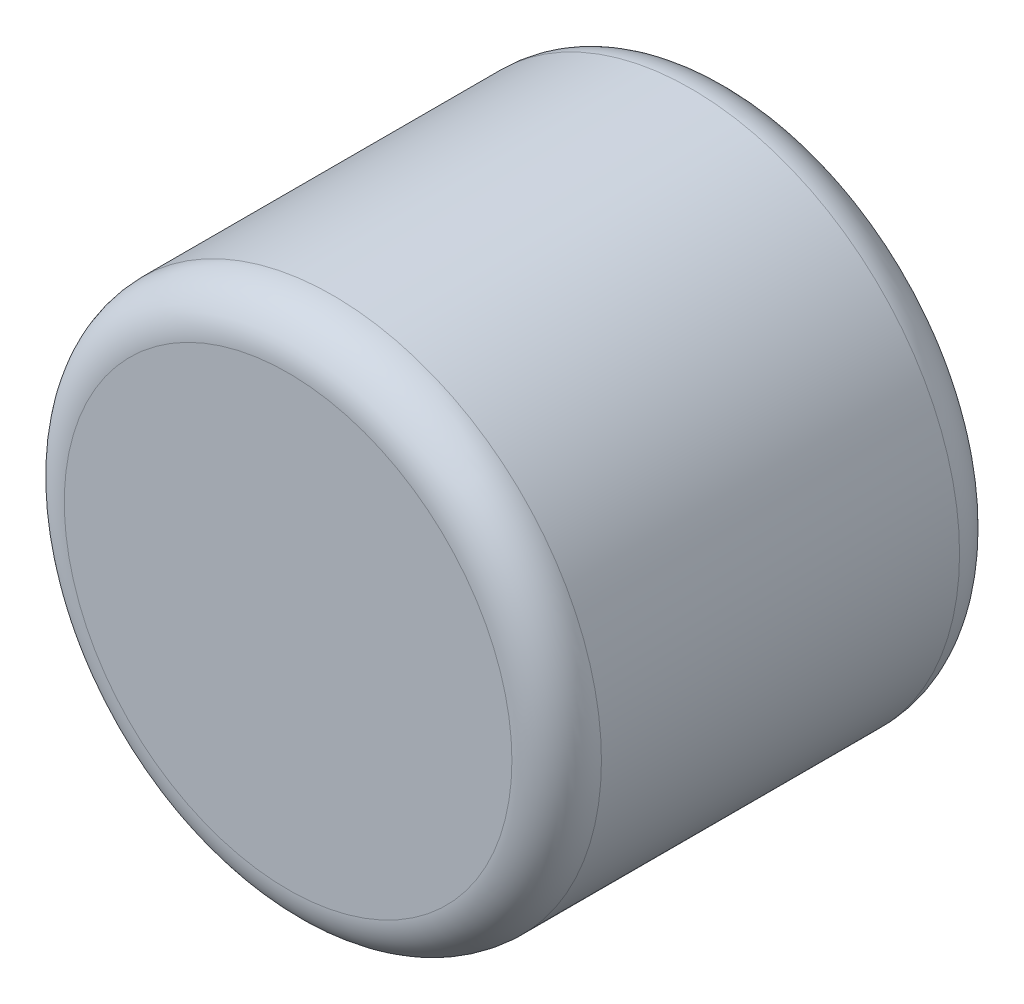
ISO-10303-21;
HEADER;
FILE_DESCRIPTION(('STEP AP214'),'2;1');
FILE_NAME('part.step','',(''),(''),'','','');
FILE_SCHEMA(('AUTOMOTIVE_DESIGN { 1 0 10303 214 1 1 1 1 }'));
ENDSEC;
DATA;
#1=APPLICATION_CONTEXT('core data for automotive mechanical design processes');
#2=APPLICATION_PROTOCOL_DEFINITION('international standard','automotive_design',2000,#1);
#3=PRODUCT_CONTEXT('',#1,'mechanical');
#4=PRODUCT('Part','Part','',(#3));
#5=PRODUCT_RELATED_PRODUCT_CATEGORY('part','',(#4));
#6=PRODUCT_DEFINITION_FORMATION('','',#4);
#7=PRODUCT_DEFINITION_CONTEXT('part definition',#1,'design');
#8=PRODUCT_DEFINITION('design','',#6,#7);
#9=PRODUCT_DEFINITION_SHAPE('','',#8);
#10=(LENGTH_UNIT() NAMED_UNIT(*) SI_UNIT(.MILLI.,.METRE.));
#11=(NAMED_UNIT(*) PLANE_ANGLE_UNIT() SI_UNIT($,.RADIAN.));
#12=(NAMED_UNIT(*) SI_UNIT($,.STERADIAN.) SOLID_ANGLE_UNIT());
#13=UNCERTAINTY_MEASURE_WITH_UNIT(LENGTH_MEASURE(1.E-05),#10,'distance_accuracy_value','');
#14=(GEOMETRIC_REPRESENTATION_CONTEXT(3) GLOBAL_UNCERTAINTY_ASSIGNED_CONTEXT((#13)) GLOBAL_UNIT_ASSIGNED_CONTEXT((#10,
#11,#12)) REPRESENTATION_CONTEXT('',''));
#15=CARTESIAN_POINT('',(0.,0.,0.));
#16=DIRECTION('',(0.,0.,1.));
#17=DIRECTION('',(1.,0.,0.));
#18=AXIS2_PLACEMENT_3D('',#15,#16,#17);
#19=CARTESIAN_POINT('',(0.,0.,25.));
#20=DIRECTION('',(0.,0.,-1.));
#21=DIRECTION('',(-1.,0.,0.));
#22=AXIS2_PLACEMENT_3D('',#19,#20,#21);
#23=CYLINDRICAL_SURFACE('',#22,30.);
#24=CARTESIAN_POINT('',(0.,0.,-20.));
#25=DIRECTION('',(0.,0.,1.));
#26=DIRECTION('',(1.,0.,0.));
#27=AXIS2_PLACEMENT_3D('',#24,#25,#26);
#28=CIRCLE('',#27,30.);
#29=CARTESIAN_POINT('',(30.,0.,-20.));
#30=VERTEX_POINT('',#29);
#31=EDGE_CURVE('E50',#30,#30,#28,.T.);
#32=ORIENTED_EDGE('',*,*,#31,.T.);
#33=EDGE_LOOP('',(#32));
#34=FACE_BOUND('',#33,.T.);
#35=CARTESIAN_POINT('',(0.,0.,20.));
#36=DIRECTION('',(0.,0.,1.));
#37=DIRECTION('',(1.,0.,0.));
#38=AXIS2_PLACEMENT_3D('',#35,#36,#37);
#39=CIRCLE('',#38,30.);
#40=CARTESIAN_POINT('',(30.,0.,20.));
#41=VERTEX_POINT('',#40);
#42=EDGE_CURVE('E55',#41,#41,#39,.F.);
#43=ORIENTED_EDGE('',*,*,#42,.T.);
#44=EDGE_LOOP('',(#43));
#45=FACE_BOUND('',#44,.T.);
#46=ADVANCED_FACE('F37',(#34,#45),#23,.T.);
#47=CARTESIAN_POINT('',(0.,0.,25.));
#48=DIRECTION('',(0.,0.,1.));
#49=DIRECTION('',(1.,0.,0.));
#50=AXIS2_PLACEMENT_3D('',#47,#48,#49);
#51=PLANE('',#50);
#52=CARTESIAN_POINT('',(0.,0.,25.));
#53=DIRECTION('',(0.,0.,1.));
#54=DIRECTION('',(1.,0.,0.));
#55=AXIS2_PLACEMENT_3D('',#52,#53,#54);
#56=CIRCLE('',#55,25.);
#57=CARTESIAN_POINT('',(25.,0.,25.));
#58=VERTEX_POINT('',#57);
#59=EDGE_CURVE('E10',#58,#58,#56,.T.);
#60=ORIENTED_EDGE('',*,*,#59,.T.);
#61=EDGE_LOOP('',(#60));
#62=FACE_BOUND('',#61,.T.);
#63=ADVANCED_FACE('F72',(#62),#51,.T.);
#64=CARTESIAN_POINT('',(0.,0.,-25.));
#65=DIRECTION('',(0.,0.,1.));
#66=DIRECTION('',(1.,0.,0.));
#67=AXIS2_PLACEMENT_3D('',#64,#65,#66);
#68=PLANE('',#67);
#69=CARTESIAN_POINT('',(0.,0.,-25.));
#70=DIRECTION('',(0.,0.,1.));
#71=DIRECTION('',(1.,0.,0.));
#72=AXIS2_PLACEMENT_3D('',#69,#70,#71);
#73=CIRCLE('',#72,25.);
#74=CARTESIAN_POINT('',(25.,0.,-25.));
#75=VERTEX_POINT('',#74);
#76=EDGE_CURVE('E45',#75,#75,#73,.F.);
#77=ORIENTED_EDGE('',*,*,#76,.T.);
#78=EDGE_LOOP('',(#77));
#79=FACE_BOUND('',#78,.T.);
#80=ADVANCED_FACE('F69',(#79),#68,.F.);
#81=CARTESIAN_POINT('',(0.,0.,-20.));
#82=DIRECTION('',(0.,0.,1.));
#83=DIRECTION('',(1.,0.,0.));
#84=AXIS2_PLACEMENT_3D('',#81,#82,#83);
#85=TOROIDAL_SURFACE('',#84,25.,5.);
#86=ORIENTED_EDGE('',*,*,#76,.F.);
#87=EDGE_LOOP('',(#86));
#88=FACE_BOUND('',#87,.T.);
#89=ORIENTED_EDGE('',*,*,#31,.F.);
#90=EDGE_LOOP('',(#89));
#91=FACE_BOUND('',#90,.T.);
#92=ADVANCED_FACE('F65',(#88,#91),#85,.T.);
#93=CARTESIAN_POINT('',(0.,0.,20.));
#94=DIRECTION('',(0.,0.,1.));
#95=DIRECTION('',(1.,0.,0.));
#96=AXIS2_PLACEMENT_3D('',#93,#94,#95);
#97=TOROIDAL_SURFACE('',#96,25.,5.);
#98=ORIENTED_EDGE('',*,*,#42,.F.);
#99=EDGE_LOOP('',(#98));
#100=FACE_BOUND('',#99,.T.);
#101=ORIENTED_EDGE('',*,*,#59,.F.);
#102=EDGE_LOOP('',(#101));
#103=FACE_BOUND('',#102,.T.);
#104=ADVANCED_FACE('F39',(#100,#103),#97,.T.);
#105=CLOSED_SHELL('',(#46,#63,#80,#92,#104));
#106=MANIFOLD_SOLID_BREP('B2',#105);
#107=ADVANCED_BREP_SHAPE_REPRESENTATION('',(#18,#106),#14);
#108=SHAPE_DEFINITION_REPRESENTATION(#9,#107);
ENDSEC;
END-ISO-10303-21;
